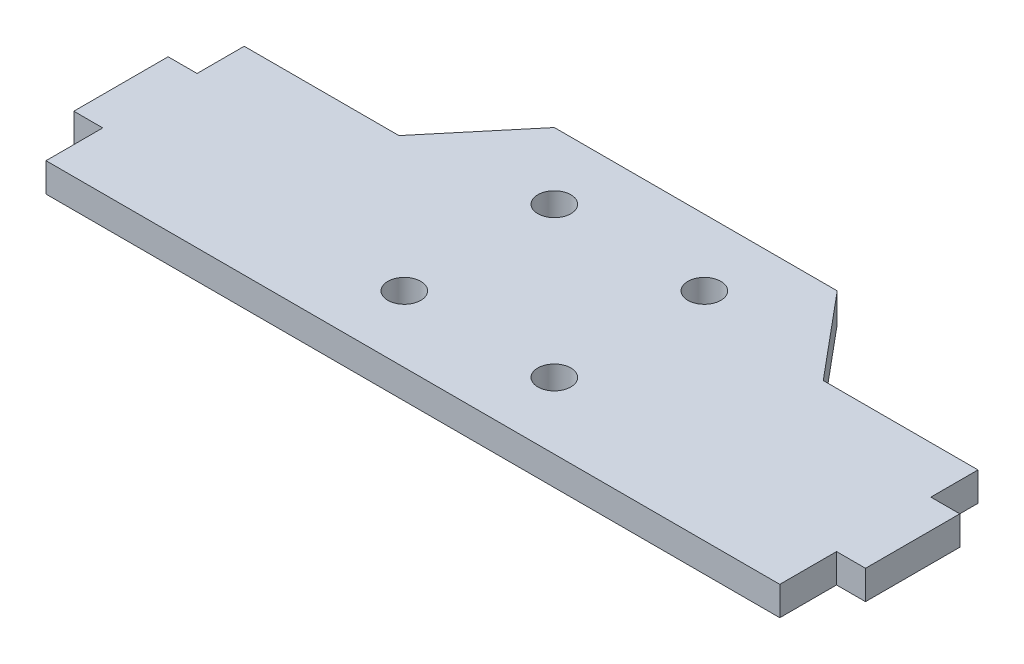
ISO-10303-21;
HEADER;
FILE_DESCRIPTION(('STEP AP214'),'2;1');
FILE_NAME('part.step','',(''),(''),'','','');
FILE_SCHEMA(('AUTOMOTIVE_DESIGN { 1 0 10303 214 1 1 1 1 }'));
ENDSEC;
DATA;
#1=APPLICATION_CONTEXT('core data for automotive mechanical design processes');
#2=APPLICATION_PROTOCOL_DEFINITION('international standard','automotive_design',2000,#1);
#3=PRODUCT_CONTEXT('',#1,'mechanical');
#4=PRODUCT('Part','Part','',(#3));
#5=PRODUCT_RELATED_PRODUCT_CATEGORY('part','',(#4));
#6=PRODUCT_DEFINITION_FORMATION('','',#4);
#7=PRODUCT_DEFINITION_CONTEXT('part definition',#1,'design');
#8=PRODUCT_DEFINITION('design','',#6,#7);
#9=PRODUCT_DEFINITION_SHAPE('','',#8);
#10=(LENGTH_UNIT() NAMED_UNIT(*) SI_UNIT(.MILLI.,.METRE.));
#11=(NAMED_UNIT(*) PLANE_ANGLE_UNIT() SI_UNIT($,.RADIAN.));
#12=(NAMED_UNIT(*) SI_UNIT($,.STERADIAN.) SOLID_ANGLE_UNIT());
#13=UNCERTAINTY_MEASURE_WITH_UNIT(LENGTH_MEASURE(1.E-05),#10,'distance_accuracy_value','');
#14=(GEOMETRIC_REPRESENTATION_CONTEXT(3) GLOBAL_UNCERTAINTY_ASSIGNED_CONTEXT((#13)) GLOBAL_UNIT_ASSIGNED_CONTEXT((#10,
#11,#12)) REPRESENTATION_CONTEXT('',''));
#15=CARTESIAN_POINT('',(0.,0.,0.));
#16=DIRECTION('',(0.,0.,1.));
#17=DIRECTION('',(1.,0.,0.));
#18=AXIS2_PLACEMENT_3D('',#15,#16,#17);
#19=CARTESIAN_POINT('',(0.,-363.21,0.));
#20=DIRECTION('',(0.,1.,0.));
#21=DIRECTION('',(0.,0.,1.));
#22=AXIS2_PLACEMENT_3D('',#19,#20,#21);
#23=PLANE('',#22);
#24=CARTESIAN_POINT('',(-7.95495128834865,-363.21,18.0450487116513));
#25=DIRECTION('',(0.,1.,0.));
#26=DIRECTION('',(0.,0.,1.));
#27=AXIS2_PLACEMENT_3D('',#24,#25,#26);
#28=CIRCLE('',#27,1.75);
#29=CARTESIAN_POINT('',(-7.95495128834865,-363.21,19.7950487116513));
#30=VERTEX_POINT('',#29);
#31=EDGE_CURVE('E524',#30,#30,#28,.T.);
#32=ORIENTED_EDGE('',*,*,#31,.F.);
#33=EDGE_LOOP('',(#32));
#34=FACE_BOUND('',#33,.T.);
#35=CARTESIAN_POINT('',(7.95495128834865,-363.21,33.9549512883487));
#36=DIRECTION('',(0.,1.,0.));
#37=DIRECTION('',(0.,0.,1.));
#38=AXIS2_PLACEMENT_3D('',#35,#36,#37);
#39=CIRCLE('',#38,1.75);
#40=CARTESIAN_POINT('',(7.95495128834865,-363.21,35.7049512883487));
#41=VERTEX_POINT('',#40);
#42=EDGE_CURVE('E196',#41,#41,#39,.T.);
#43=ORIENTED_EDGE('',*,*,#42,.F.);
#44=EDGE_LOOP('',(#43));
#45=FACE_BOUND('',#44,.T.);
#46=DIRECTION('',(1.,0.,0.));
#47=VECTOR('',#46,1.);
#48=CARTESIAN_POINT('',(38.9099999999999,-363.21,41.));
#49=LINE('',#48,#47);
#50=CARTESIAN_POINT('',(-38.9099999999999,-363.21,41.));
#51=VERTEX_POINT('',#50);
#52=CARTESIAN_POINT('',(38.9099999999999,-363.21,41.));
#53=VERTEX_POINT('',#52);
#54=EDGE_CURVE('E60',#51,#53,#49,.T.);
#55=ORIENTED_EDGE('',*,*,#54,.T.);
#56=DIRECTION('',(0.,0.,-1.));
#57=VECTOR('',#56,1.);
#58=CARTESIAN_POINT('',(38.9099999999999,-363.21,34.98));
#59=LINE('',#58,#57);
#60=CARTESIAN_POINT('',(38.9099999999999,-363.21,34.98));
#61=VERTEX_POINT('',#60);
#62=EDGE_CURVE('E129',#53,#61,#59,.T.);
#63=ORIENTED_EDGE('',*,*,#62,.T.);
#64=DIRECTION('',(1.,0.,0.));
#65=VECTOR('',#64,1.);
#66=CARTESIAN_POINT('',(41.9799999999999,-363.21,34.98));
#67=LINE('',#66,#65);
#68=CARTESIAN_POINT('',(41.9799999999999,-363.21,34.98));
#69=VERTEX_POINT('',#68);
#70=EDGE_CURVE('E261',#61,#69,#67,.T.);
#71=ORIENTED_EDGE('',*,*,#70,.T.);
#72=DIRECTION('',(0.,0.,-1.));
#73=VECTOR('',#72,1.);
#74=CARTESIAN_POINT('',(41.9799999999999,-363.21,24.98));
#75=LINE('',#74,#73);
#76=CARTESIAN_POINT('',(41.9799999999999,-363.21,24.98));
#77=VERTEX_POINT('',#76);
#78=EDGE_CURVE('E278',#69,#77,#75,.T.);
#79=ORIENTED_EDGE('',*,*,#78,.T.);
#80=DIRECTION('',(-1.,0.,0.));
#81=VECTOR('',#80,1.);
#82=CARTESIAN_POINT('',(38.9099999999999,-363.21,24.98));
#83=LINE('',#82,#81);
#84=CARTESIAN_POINT('',(38.9099999999999,-363.21,24.98));
#85=VERTEX_POINT('',#84);
#86=EDGE_CURVE('E275',#77,#85,#83,.T.);
#87=ORIENTED_EDGE('',*,*,#86,.T.);
#88=DIRECTION('',(0.,0.,-1.));
#89=VECTOR('',#88,1.);
#90=CARTESIAN_POINT('',(38.9099999999999,-363.21,19.98));
#91=LINE('',#90,#89);
#92=CARTESIAN_POINT('',(38.9099999999999,-363.21,19.98));
#93=VERTEX_POINT('',#92);
#94=EDGE_CURVE('E277',#85,#93,#91,.T.);
#95=ORIENTED_EDGE('',*,*,#94,.T.);
#96=DIRECTION('',(-1.,0.,0.));
#97=VECTOR('',#96,1.);
#98=CARTESIAN_POINT('',(22.5,-363.21,19.98));
#99=LINE('',#98,#97);
#100=CARTESIAN_POINT('',(22.5,-363.21,19.98));
#101=VERTEX_POINT('',#100);
#102=EDGE_CURVE('E280',#93,#101,#99,.T.);
#103=ORIENTED_EDGE('',*,*,#102,.T.);
#104=DIRECTION('',(-0.641024704471856,0.,-0.767520246154308));
#105=VECTOR('',#104,1.);
#106=CARTESIAN_POINT('',(15.,-363.21,11.));
#107=LINE('',#106,#105);
#108=CARTESIAN_POINT('',(15.,-363.21,11.));
#109=VERTEX_POINT('',#108);
#110=EDGE_CURVE('E286',#101,#109,#107,.T.);
#111=ORIENTED_EDGE('',*,*,#110,.T.);
#112=DIRECTION('',(-1.,0.,0.));
#113=VECTOR('',#112,1.);
#114=CARTESIAN_POINT('',(15.,-363.21,11.));
#115=LINE('',#114,#113);
#116=CARTESIAN_POINT('',(-15.,-363.21,11.));
#117=VERTEX_POINT('',#116);
#118=EDGE_CURVE('E288',#109,#117,#115,.T.);
#119=ORIENTED_EDGE('',*,*,#118,.T.);
#120=DIRECTION('',(-0.641024704471856,0.,0.767520246154308));
#121=VECTOR('',#120,1.);
#122=CARTESIAN_POINT('',(-15.,-363.21,11.));
#123=LINE('',#122,#121);
#124=CARTESIAN_POINT('',(-22.4999999999999,-363.21,19.98));
#125=VERTEX_POINT('',#124);
#126=EDGE_CURVE('E290',#117,#125,#123,.T.);
#127=ORIENTED_EDGE('',*,*,#126,.T.);
#128=DIRECTION('',(-1.,0.,0.));
#129=VECTOR('',#128,1.);
#130=CARTESIAN_POINT('',(-22.4999999999999,-363.21,19.98));
#131=LINE('',#130,#129);
#132=CARTESIAN_POINT('',(-38.9099999999999,-363.21,19.98));
#133=VERTEX_POINT('',#132);
#134=EDGE_CURVE('E292',#125,#133,#131,.T.);
#135=ORIENTED_EDGE('',*,*,#134,.T.);
#136=DIRECTION('',(0.,0.,1.));
#137=VECTOR('',#136,1.);
#138=CARTESIAN_POINT('',(-38.9099999999999,-363.21,19.98));
#139=LINE('',#138,#137);
#140=CARTESIAN_POINT('',(-38.9099999999999,-363.21,24.98));
#141=VERTEX_POINT('',#140);
#142=EDGE_CURVE('E294',#133,#141,#139,.T.);
#143=ORIENTED_EDGE('',*,*,#142,.T.);
#144=DIRECTION('',(-1.,0.,0.));
#145=VECTOR('',#144,1.);
#146=CARTESIAN_POINT('',(-38.9099999999999,-363.21,24.98));
#147=LINE('',#146,#145);
#148=CARTESIAN_POINT('',(-41.9799999999999,-363.21,24.98));
#149=VERTEX_POINT('',#148);
#150=EDGE_CURVE('E173',#141,#149,#147,.T.);
#151=ORIENTED_EDGE('',*,*,#150,.T.);
#152=DIRECTION('',(0.,0.,1.));
#153=VECTOR('',#152,1.);
#154=CARTESIAN_POINT('',(-41.9799999999999,-363.21,24.98));
#155=LINE('',#154,#153);
#156=CARTESIAN_POINT('',(-41.9799999999999,-363.21,34.98));
#157=VERTEX_POINT('',#156);
#158=EDGE_CURVE('E167',#149,#157,#155,.T.);
#159=ORIENTED_EDGE('',*,*,#158,.T.);
#160=DIRECTION('',(1.,0.,0.));
#161=VECTOR('',#160,1.);
#162=CARTESIAN_POINT('',(-41.9799999999999,-363.21,34.98));
#163=LINE('',#162,#161);
#164=CARTESIAN_POINT('',(-38.9099999999999,-363.21,34.98));
#165=VERTEX_POINT('',#164);
#166=EDGE_CURVE('E171',#157,#165,#163,.T.);
#167=ORIENTED_EDGE('',*,*,#166,.T.);
#168=DIRECTION('',(0.,0.,1.));
#169=VECTOR('',#168,1.);
#170=CARTESIAN_POINT('',(-38.9099999999999,-363.21,34.98));
#171=LINE('',#170,#169);
#172=EDGE_CURVE('E187',#165,#51,#171,.T.);
#173=ORIENTED_EDGE('',*,*,#172,.T.);
#174=EDGE_LOOP('',(#55,#63,#71,#79,#87,#95,#103,#111,#119,#127,#135,#143,#151,#159,#167,#173));
#175=FACE_BOUND('',#174,.T.);
#176=CARTESIAN_POINT('',(-7.95495128834867,-363.21,33.9549512883486));
#177=DIRECTION('',(0.,1.,0.));
#178=DIRECTION('',(0.,0.,1.));
#179=AXIS2_PLACEMENT_3D('',#176,#177,#178);
#180=CIRCLE('',#179,1.75);
#181=CARTESIAN_POINT('',(-7.95495128834867,-363.21,35.7049512883486));
#182=VERTEX_POINT('',#181);
#183=EDGE_CURVE('E530',#182,#182,#180,.T.);
#184=ORIENTED_EDGE('',*,*,#183,.F.);
#185=EDGE_LOOP('',(#184));
#186=FACE_BOUND('',#185,.T.);
#187=CARTESIAN_POINT('',(7.95495128834867,-363.21,18.0450487116514));
#188=DIRECTION('',(0.,1.,0.));
#189=DIRECTION('',(0.,0.,1.));
#190=AXIS2_PLACEMENT_3D('',#187,#188,#189);
#191=CIRCLE('',#190,1.75);
#192=CARTESIAN_POINT('',(7.95495128834867,-363.21,19.7950487116514));
#193=VERTEX_POINT('',#192);
#194=EDGE_CURVE('E515',#193,#193,#191,.T.);
#195=ORIENTED_EDGE('',*,*,#194,.F.);
#196=EDGE_LOOP('',(#195));
#197=FACE_BOUND('',#196,.T.);
#198=ADVANCED_FACE('F43',(#34,#45,#175,#186,#197),#23,.T.);
#199=CARTESIAN_POINT('',(0.,-366.28,0.));
#200=DIRECTION('',(0.,1.,0.));
#201=DIRECTION('',(0.,0.,1.));
#202=AXIS2_PLACEMENT_3D('',#199,#200,#201);
#203=PLANE('',#202);
#204=DIRECTION('',(0.,0.,-1.));
#205=VECTOR('',#204,1.);
#206=CARTESIAN_POINT('',(38.9099999999999,-366.28,34.98));
#207=LINE('',#206,#205);
#208=CARTESIAN_POINT('',(38.9099999999999,-366.28,41.));
#209=VERTEX_POINT('',#208);
#210=CARTESIAN_POINT('',(38.9099999999999,-366.28,34.98));
#211=VERTEX_POINT('',#210);
#212=EDGE_CURVE('E193',#209,#211,#207,.T.);
#213=ORIENTED_EDGE('',*,*,#212,.F.);
#214=DIRECTION('',(1.,0.,0.));
#215=VECTOR('',#214,1.);
#216=CARTESIAN_POINT('',(15.,-366.28,41.));
#217=LINE('',#216,#215);
#218=CARTESIAN_POINT('',(-38.9099999999999,-366.28,41.));
#219=VERTEX_POINT('',#218);
#220=EDGE_CURVE('E121',#219,#209,#217,.T.);
#221=ORIENTED_EDGE('',*,*,#220,.F.);
#222=DIRECTION('',(0.,0.,1.));
#223=VECTOR('',#222,1.);
#224=CARTESIAN_POINT('',(-38.9099999999999,-366.28,34.98));
#225=LINE('',#224,#223);
#226=CARTESIAN_POINT('',(-38.9099999999999,-366.28,34.98));
#227=VERTEX_POINT('',#226);
#228=EDGE_CURVE('E220',#227,#219,#225,.T.);
#229=ORIENTED_EDGE('',*,*,#228,.F.);
#230=DIRECTION('',(1.,0.,0.));
#231=VECTOR('',#230,1.);
#232=CARTESIAN_POINT('',(-41.9799999999999,-366.28,34.98));
#233=LINE('',#232,#231);
#234=CARTESIAN_POINT('',(-41.9799999999999,-366.28,34.98));
#235=VERTEX_POINT('',#234);
#236=EDGE_CURVE('E114',#235,#227,#233,.T.);
#237=ORIENTED_EDGE('',*,*,#236,.F.);
#238=DIRECTION('',(0.,0.,1.));
#239=VECTOR('',#238,1.);
#240=CARTESIAN_POINT('',(-41.9799999999999,-366.28,24.98));
#241=LINE('',#240,#239);
#242=CARTESIAN_POINT('',(-41.9799999999999,-366.28,24.98));
#243=VERTEX_POINT('',#242);
#244=EDGE_CURVE('E181',#243,#235,#241,.T.);
#245=ORIENTED_EDGE('',*,*,#244,.F.);
#246=DIRECTION('',(-1.,0.,0.));
#247=VECTOR('',#246,1.);
#248=CARTESIAN_POINT('',(-38.9099999999999,-366.28,24.98));
#249=LINE('',#248,#247);
#250=CARTESIAN_POINT('',(-38.9099999999999,-366.28,24.98));
#251=VERTEX_POINT('',#250);
#252=EDGE_CURVE('E216',#251,#243,#249,.T.);
#253=ORIENTED_EDGE('',*,*,#252,.F.);
#254=DIRECTION('',(0.,0.,1.));
#255=VECTOR('',#254,1.);
#256=CARTESIAN_POINT('',(-38.9099999999999,-366.28,19.98));
#257=LINE('',#256,#255);
#258=CARTESIAN_POINT('',(-38.9099999999999,-366.28,19.98));
#259=VERTEX_POINT('',#258);
#260=EDGE_CURVE('E214',#259,#251,#257,.T.);
#261=ORIENTED_EDGE('',*,*,#260,.F.);
#262=DIRECTION('',(-1.,0.,0.));
#263=VECTOR('',#262,1.);
#264=CARTESIAN_POINT('',(-22.4999999999999,-366.28,19.98));
#265=LINE('',#264,#263);
#266=CARTESIAN_POINT('',(-22.4999999999999,-366.28,19.98));
#267=VERTEX_POINT('',#266);
#268=EDGE_CURVE('E212',#267,#259,#265,.T.);
#269=ORIENTED_EDGE('',*,*,#268,.F.);
#270=DIRECTION('',(-0.641024704471856,0.,0.767520246154308));
#271=VECTOR('',#270,1.);
#272=CARTESIAN_POINT('',(-15.,-366.28,11.));
#273=LINE('',#272,#271);
#274=CARTESIAN_POINT('',(-15.,-366.28,11.));
#275=VERTEX_POINT('',#274);
#276=EDGE_CURVE('E210',#275,#267,#273,.T.);
#277=ORIENTED_EDGE('',*,*,#276,.F.);
#278=DIRECTION('',(-1.,0.,0.));
#279=VECTOR('',#278,1.);
#280=CARTESIAN_POINT('',(15.,-366.28,11.));
#281=LINE('',#280,#279);
#282=CARTESIAN_POINT('',(15.,-366.28,11.));
#283=VERTEX_POINT('',#282);
#284=EDGE_CURVE('E208',#283,#275,#281,.T.);
#285=ORIENTED_EDGE('',*,*,#284,.F.);
#286=DIRECTION('',(-0.641024704471856,0.,-0.767520246154308));
#287=VECTOR('',#286,1.);
#288=CARTESIAN_POINT('',(15.,-366.28,11.));
#289=LINE('',#288,#287);
#290=CARTESIAN_POINT('',(22.5,-366.28,19.98));
#291=VERTEX_POINT('',#290);
#292=EDGE_CURVE('E206',#291,#283,#289,.T.);
#293=ORIENTED_EDGE('',*,*,#292,.F.);
#294=DIRECTION('',(-1.,0.,0.));
#295=VECTOR('',#294,1.);
#296=CARTESIAN_POINT('',(22.5,-366.28,19.98));
#297=LINE('',#296,#295);
#298=CARTESIAN_POINT('',(38.9099999999999,-366.28,19.98));
#299=VERTEX_POINT('',#298);
#300=EDGE_CURVE('E204',#299,#291,#297,.T.);
#301=ORIENTED_EDGE('',*,*,#300,.F.);
#302=DIRECTION('',(0.,0.,-1.));
#303=VECTOR('',#302,1.);
#304=CARTESIAN_POINT('',(38.9099999999999,-366.28,19.98));
#305=LINE('',#304,#303);
#306=CARTESIAN_POINT('',(38.9099999999999,-366.28,24.98));
#307=VERTEX_POINT('',#306);
#308=EDGE_CURVE('E202',#307,#299,#305,.T.);
#309=ORIENTED_EDGE('',*,*,#308,.F.);
#310=DIRECTION('',(-1.,0.,0.));
#311=VECTOR('',#310,1.);
#312=CARTESIAN_POINT('',(38.9099999999999,-366.28,24.98));
#313=LINE('',#312,#311);
#314=CARTESIAN_POINT('',(41.9799999999999,-366.28,24.98));
#315=VERTEX_POINT('',#314);
#316=EDGE_CURVE('E200',#315,#307,#313,.T.);
#317=ORIENTED_EDGE('',*,*,#316,.F.);
#318=DIRECTION('',(0.,0.,-1.));
#319=VECTOR('',#318,1.);
#320=CARTESIAN_POINT('',(41.9799999999999,-366.28,24.98));
#321=LINE('',#320,#319);
#322=CARTESIAN_POINT('',(41.9799999999999,-366.28,34.98));
#323=VERTEX_POINT('',#322);
#324=EDGE_CURVE('E198',#323,#315,#321,.T.);
#325=ORIENTED_EDGE('',*,*,#324,.F.);
#326=DIRECTION('',(1.,0.,0.));
#327=VECTOR('',#326,1.);
#328=CARTESIAN_POINT('',(41.9799999999999,-366.28,34.98));
#329=LINE('',#328,#327);
#330=EDGE_CURVE('E195',#211,#323,#329,.T.);
#331=ORIENTED_EDGE('',*,*,#330,.F.);
#332=EDGE_LOOP('',(#213,#221,#229,#237,#245,#253,#261,#269,#277,#285,#293,#301,#309,#317,#325,#331));
#333=FACE_BOUND('',#332,.T.);
#334=CARTESIAN_POINT('',(7.95495128834865,-366.28,33.9549512883487));
#335=DIRECTION('',(0.,1.,0.));
#336=DIRECTION('',(0.,0.,1.));
#337=AXIS2_PLACEMENT_3D('',#334,#335,#336);
#338=CIRCLE('',#337,1.75);
#339=CARTESIAN_POINT('',(7.95495128834865,-366.28,35.7049512883487));
#340=VERTEX_POINT('',#339);
#341=EDGE_CURVE('E533',#340,#340,#338,.T.);
#342=ORIENTED_EDGE('',*,*,#341,.T.);
#343=EDGE_LOOP('',(#342));
#344=FACE_BOUND('',#343,.T.);
#345=CARTESIAN_POINT('',(-7.95495128834867,-366.28,33.9549512883486));
#346=DIRECTION('',(0.,1.,0.));
#347=DIRECTION('',(0.,0.,1.));
#348=AXIS2_PLACEMENT_3D('',#345,#346,#347);
#349=CIRCLE('',#348,1.75);
#350=CARTESIAN_POINT('',(-7.95495128834867,-366.28,35.7049512883486));
#351=VERTEX_POINT('',#350);
#352=EDGE_CURVE('E527',#351,#351,#349,.T.);
#353=ORIENTED_EDGE('',*,*,#352,.T.);
#354=EDGE_LOOP('',(#353));
#355=FACE_BOUND('',#354,.T.);
#356=CARTESIAN_POINT('',(-7.95495128834865,-366.28,18.0450487116513));
#357=DIRECTION('',(0.,1.,0.));
#358=DIRECTION('',(0.,0.,1.));
#359=AXIS2_PLACEMENT_3D('',#356,#357,#358);
#360=CIRCLE('',#359,1.75);
#361=CARTESIAN_POINT('',(-7.95495128834865,-366.28,19.7950487116513));
#362=VERTEX_POINT('',#361);
#363=EDGE_CURVE('E521',#362,#362,#360,.T.);
#364=ORIENTED_EDGE('',*,*,#363,.T.);
#365=EDGE_LOOP('',(#364));
#366=FACE_BOUND('',#365,.T.);
#367=CARTESIAN_POINT('',(7.95495128834867,-366.28,18.0450487116514));
#368=DIRECTION('',(0.,1.,0.));
#369=DIRECTION('',(0.,0.,1.));
#370=AXIS2_PLACEMENT_3D('',#367,#368,#369);
#371=CIRCLE('',#370,1.75);
#372=CARTESIAN_POINT('',(7.95495128834867,-366.28,19.7950487116514));
#373=VERTEX_POINT('',#372);
#374=EDGE_CURVE('E518',#373,#373,#371,.T.);
#375=ORIENTED_EDGE('',*,*,#374,.T.);
#376=EDGE_LOOP('',(#375));
#377=FACE_BOUND('',#376,.T.);
#378=ADVANCED_FACE('F263',(#333,#344,#355,#366,#377),#203,.F.);
#379=CARTESIAN_POINT('',(38.9099999999999,-363.21,34.98));
#380=DIRECTION('',(-1.,0.,0.));
#381=DIRECTION('',(0.,0.,1.));
#382=AXIS2_PLACEMENT_3D('',#379,#380,#381);
#383=PLANE('',#382);
#384=ORIENTED_EDGE('',*,*,#212,.T.);
#385=DIRECTION('',(0.,-1.,0.));
#386=VECTOR('',#385,1.);
#387=CARTESIAN_POINT('',(38.9099999999999,-363.21,34.98));
#388=LINE('',#387,#386);
#389=EDGE_CURVE('E52',#61,#211,#388,.T.);
#390=ORIENTED_EDGE('',*,*,#389,.F.);
#391=ORIENTED_EDGE('',*,*,#62,.F.);
#392=DIRECTION('',(0.,-1.,0.));
#393=VECTOR('',#392,1.);
#394=CARTESIAN_POINT('',(38.9099999999999,-363.21,41.));
#395=LINE('',#394,#393);
#396=EDGE_CURVE('E11',#53,#209,#395,.T.);
#397=ORIENTED_EDGE('',*,*,#396,.T.);
#398=EDGE_LOOP('',(#384,#390,#391,#397));
#399=FACE_BOUND('',#398,.T.);
#400=ADVANCED_FACE('F45',(#399),#383,.F.);
#401=CARTESIAN_POINT('',(41.9799999999999,-363.21,34.98));
#402=DIRECTION('',(0.,0.,-1.));
#403=DIRECTION('',(-1.,0.,0.));
#404=AXIS2_PLACEMENT_3D('',#401,#402,#403);
#405=PLANE('',#404);
#406=ORIENTED_EDGE('',*,*,#330,.T.);
#407=DIRECTION('',(0.,-1.,0.));
#408=VECTOR('',#407,1.);
#409=CARTESIAN_POINT('',(41.9799999999999,-363.21,34.98));
#410=LINE('',#409,#408);
#411=EDGE_CURVE('E253',#69,#323,#410,.T.);
#412=ORIENTED_EDGE('',*,*,#411,.F.);
#413=ORIENTED_EDGE('',*,*,#70,.F.);
#414=ORIENTED_EDGE('',*,*,#389,.T.);
#415=EDGE_LOOP('',(#406,#412,#413,#414));
#416=FACE_BOUND('',#415,.T.);
#417=ADVANCED_FACE('F259',(#416),#405,.F.);
#418=CARTESIAN_POINT('',(41.9799999999999,-363.21,24.98));
#419=DIRECTION('',(-1.,0.,0.));
#420=DIRECTION('',(0.,0.,1.));
#421=AXIS2_PLACEMENT_3D('',#418,#419,#420);
#422=PLANE('',#421);
#423=ORIENTED_EDGE('',*,*,#324,.T.);
#424=DIRECTION('',(0.,-1.,0.));
#425=VECTOR('',#424,1.);
#426=CARTESIAN_POINT('',(41.9799999999999,-363.21,24.98));
#427=LINE('',#426,#425);
#428=EDGE_CURVE('E250',#77,#315,#427,.T.);
#429=ORIENTED_EDGE('',*,*,#428,.F.);
#430=ORIENTED_EDGE('',*,*,#78,.F.);
#431=ORIENTED_EDGE('',*,*,#411,.T.);
#432=EDGE_LOOP('',(#423,#429,#430,#431));
#433=FACE_BOUND('',#432,.T.);
#434=ADVANCED_FACE('F269',(#433),#422,.F.);
#435=CARTESIAN_POINT('',(38.9099999999999,-363.21,24.98));
#436=DIRECTION('',(0.,0.,1.));
#437=DIRECTION('',(1.,0.,0.));
#438=AXIS2_PLACEMENT_3D('',#435,#436,#437);
#439=PLANE('',#438);
#440=ORIENTED_EDGE('',*,*,#316,.T.);
#441=DIRECTION('',(0.,-1.,0.));
#442=VECTOR('',#441,1.);
#443=CARTESIAN_POINT('',(38.9099999999999,-363.21,24.98));
#444=LINE('',#443,#442);
#445=EDGE_CURVE('E247',#85,#307,#444,.T.);
#446=ORIENTED_EDGE('',*,*,#445,.F.);
#447=ORIENTED_EDGE('',*,*,#86,.F.);
#448=ORIENTED_EDGE('',*,*,#428,.T.);
#449=EDGE_LOOP('',(#440,#446,#447,#448));
#450=FACE_BOUND('',#449,.T.);
#451=ADVANCED_FACE('F273',(#450),#439,.F.);
#452=CARTESIAN_POINT('',(38.9099999999999,-363.21,19.98));
#453=DIRECTION('',(-1.,0.,0.));
#454=DIRECTION('',(0.,0.,1.));
#455=AXIS2_PLACEMENT_3D('',#452,#453,#454);
#456=PLANE('',#455);
#457=ORIENTED_EDGE('',*,*,#308,.T.);
#458=DIRECTION('',(0.,-1.,0.));
#459=VECTOR('',#458,1.);
#460=CARTESIAN_POINT('',(38.9099999999999,-363.21,19.98));
#461=LINE('',#460,#459);
#462=EDGE_CURVE('E244',#93,#299,#461,.T.);
#463=ORIENTED_EDGE('',*,*,#462,.F.);
#464=ORIENTED_EDGE('',*,*,#94,.F.);
#465=ORIENTED_EDGE('',*,*,#445,.T.);
#466=EDGE_LOOP('',(#457,#463,#464,#465));
#467=FACE_BOUND('',#466,.T.);
#468=ADVANCED_FACE('F359',(#467),#456,.F.);
#469=CARTESIAN_POINT('',(22.5,-363.21,19.98));
#470=DIRECTION('',(0.,0.,1.));
#471=DIRECTION('',(1.,0.,0.));
#472=AXIS2_PLACEMENT_3D('',#469,#470,#471);
#473=PLANE('',#472);
#474=ORIENTED_EDGE('',*,*,#300,.T.);
#475=DIRECTION('',(0.,-1.,0.));
#476=VECTOR('',#475,1.);
#477=CARTESIAN_POINT('',(22.5,-363.21,19.98));
#478=LINE('',#477,#476);
#479=EDGE_CURVE('E241',#101,#291,#478,.T.);
#480=ORIENTED_EDGE('',*,*,#479,.F.);
#481=ORIENTED_EDGE('',*,*,#102,.F.);
#482=ORIENTED_EDGE('',*,*,#462,.T.);
#483=EDGE_LOOP('',(#474,#480,#481,#482));
#484=FACE_BOUND('',#483,.T.);
#485=ADVANCED_FACE('F355',(#484),#473,.F.);
#486=CARTESIAN_POINT('',(15.,-363.21,11.));
#487=DIRECTION('',(-0.767520246154308,0.,0.641024704471856));
#488=DIRECTION('',(0.641024704471856,0.,0.767520246154308));
#489=AXIS2_PLACEMENT_3D('',#486,#487,#488);
#490=PLANE('',#489);
#491=ORIENTED_EDGE('',*,*,#292,.T.);
#492=DIRECTION('',(0.,-1.,0.));
#493=VECTOR('',#492,1.);
#494=CARTESIAN_POINT('',(15.,-363.21,11.));
#495=LINE('',#494,#493);
#496=EDGE_CURVE('E238',#109,#283,#495,.T.);
#497=ORIENTED_EDGE('',*,*,#496,.F.);
#498=ORIENTED_EDGE('',*,*,#110,.F.);
#499=ORIENTED_EDGE('',*,*,#479,.T.);
#500=EDGE_LOOP('',(#491,#497,#498,#499));
#501=FACE_BOUND('',#500,.T.);
#502=ADVANCED_FACE('F351',(#501),#490,.F.);
#503=CARTESIAN_POINT('',(15.,-363.21,11.));
#504=DIRECTION('',(0.,0.,1.));
#505=DIRECTION('',(1.,0.,0.));
#506=AXIS2_PLACEMENT_3D('',#503,#504,#505);
#507=PLANE('',#506);
#508=ORIENTED_EDGE('',*,*,#284,.T.);
#509=DIRECTION('',(0.,-1.,0.));
#510=VECTOR('',#509,1.);
#511=CARTESIAN_POINT('',(-15.,-363.21,11.));
#512=LINE('',#511,#510);
#513=EDGE_CURVE('E235',#117,#275,#512,.T.);
#514=ORIENTED_EDGE('',*,*,#513,.F.);
#515=ORIENTED_EDGE('',*,*,#118,.F.);
#516=ORIENTED_EDGE('',*,*,#496,.T.);
#517=EDGE_LOOP('',(#508,#514,#515,#516));
#518=FACE_BOUND('',#517,.T.);
#519=ADVANCED_FACE('F347',(#518),#507,.F.);
#520=CARTESIAN_POINT('',(-15.,-363.21,11.));
#521=DIRECTION('',(0.767520246154308,0.,0.641024704471856));
#522=DIRECTION('',(0.641024704471856,0.,-0.767520246154308));
#523=AXIS2_PLACEMENT_3D('',#520,#521,#522);
#524=PLANE('',#523);
#525=ORIENTED_EDGE('',*,*,#276,.T.);
#526=DIRECTION('',(0.,-1.,0.));
#527=VECTOR('',#526,1.);
#528=CARTESIAN_POINT('',(-22.4999999999999,-363.21,19.98));
#529=LINE('',#528,#527);
#530=EDGE_CURVE('E232',#125,#267,#529,.T.);
#531=ORIENTED_EDGE('',*,*,#530,.F.);
#532=ORIENTED_EDGE('',*,*,#126,.F.);
#533=ORIENTED_EDGE('',*,*,#513,.T.);
#534=EDGE_LOOP('',(#525,#531,#532,#533));
#535=FACE_BOUND('',#534,.T.);
#536=ADVANCED_FACE('F343',(#535),#524,.F.);
#537=CARTESIAN_POINT('',(-22.4999999999999,-363.21,19.98));
#538=DIRECTION('',(0.,0.,1.));
#539=DIRECTION('',(1.,0.,0.));
#540=AXIS2_PLACEMENT_3D('',#537,#538,#539);
#541=PLANE('',#540);
#542=ORIENTED_EDGE('',*,*,#268,.T.);
#543=DIRECTION('',(0.,-1.,0.));
#544=VECTOR('',#543,1.);
#545=CARTESIAN_POINT('',(-38.9099999999999,-363.21,19.98));
#546=LINE('',#545,#544);
#547=EDGE_CURVE('E229',#133,#259,#546,.T.);
#548=ORIENTED_EDGE('',*,*,#547,.F.);
#549=ORIENTED_EDGE('',*,*,#134,.F.);
#550=ORIENTED_EDGE('',*,*,#530,.T.);
#551=EDGE_LOOP('',(#542,#548,#549,#550));
#552=FACE_BOUND('',#551,.T.);
#553=ADVANCED_FACE('F340',(#552),#541,.F.);
#554=CARTESIAN_POINT('',(-38.9099999999999,-363.21,19.98));
#555=DIRECTION('',(1.,0.,0.));
#556=DIRECTION('',(0.,0.,-1.));
#557=AXIS2_PLACEMENT_3D('',#554,#555,#556);
#558=PLANE('',#557);
#559=ORIENTED_EDGE('',*,*,#260,.T.);
#560=DIRECTION('',(0.,-1.,0.));
#561=VECTOR('',#560,1.);
#562=CARTESIAN_POINT('',(-38.9099999999999,-363.21,24.98));
#563=LINE('',#562,#561);
#564=EDGE_CURVE('E226',#141,#251,#563,.T.);
#565=ORIENTED_EDGE('',*,*,#564,.F.);
#566=ORIENTED_EDGE('',*,*,#142,.F.);
#567=ORIENTED_EDGE('',*,*,#547,.T.);
#568=EDGE_LOOP('',(#559,#565,#566,#567));
#569=FACE_BOUND('',#568,.T.);
#570=ADVANCED_FACE('F300',(#569),#558,.F.);
#571=CARTESIAN_POINT('',(-38.9099999999999,-363.21,24.98));
#572=DIRECTION('',(0.,0.,1.));
#573=DIRECTION('',(1.,0.,0.));
#574=AXIS2_PLACEMENT_3D('',#571,#572,#573);
#575=PLANE('',#574);
#576=ORIENTED_EDGE('',*,*,#252,.T.);
#577=DIRECTION('',(0.,-1.,0.));
#578=VECTOR('',#577,1.);
#579=CARTESIAN_POINT('',(-41.9799999999999,-363.21,24.98));
#580=LINE('',#579,#578);
#581=EDGE_CURVE('E182',#149,#243,#580,.T.);
#582=ORIENTED_EDGE('',*,*,#581,.F.);
#583=ORIENTED_EDGE('',*,*,#150,.F.);
#584=ORIENTED_EDGE('',*,*,#564,.T.);
#585=EDGE_LOOP('',(#576,#582,#583,#584));
#586=FACE_BOUND('',#585,.T.);
#587=ADVANCED_FACE('F304',(#586),#575,.F.);
#588=CARTESIAN_POINT('',(-41.9799999999999,-363.21,24.98));
#589=DIRECTION('',(1.,0.,0.));
#590=DIRECTION('',(0.,0.,-1.));
#591=AXIS2_PLACEMENT_3D('',#588,#589,#590);
#592=PLANE('',#591);
#593=ORIENTED_EDGE('',*,*,#244,.T.);
#594=DIRECTION('',(0.,-1.,0.));
#595=VECTOR('',#594,1.);
#596=CARTESIAN_POINT('',(-41.9799999999999,-363.21,34.98));
#597=LINE('',#596,#595);
#598=EDGE_CURVE('E178',#157,#235,#597,.T.);
#599=ORIENTED_EDGE('',*,*,#598,.F.);
#600=ORIENTED_EDGE('',*,*,#158,.F.);
#601=ORIENTED_EDGE('',*,*,#581,.T.);
#602=EDGE_LOOP('',(#593,#599,#600,#601));
#603=FACE_BOUND('',#602,.T.);
#604=ADVANCED_FACE('F179',(#603),#592,.F.);
#605=CARTESIAN_POINT('',(-41.9799999999999,-363.21,34.98));
#606=DIRECTION('',(0.,0.,-1.));
#607=DIRECTION('',(-1.,0.,0.));
#608=AXIS2_PLACEMENT_3D('',#605,#606,#607);
#609=PLANE('',#608);
#610=ORIENTED_EDGE('',*,*,#236,.T.);
#611=DIRECTION('',(0.,-1.,0.));
#612=VECTOR('',#611,1.);
#613=CARTESIAN_POINT('',(-38.9099999999999,-363.21,34.98));
#614=LINE('',#613,#612);
#615=EDGE_CURVE('E183',#165,#227,#614,.T.);
#616=ORIENTED_EDGE('',*,*,#615,.F.);
#617=ORIENTED_EDGE('',*,*,#166,.F.);
#618=ORIENTED_EDGE('',*,*,#598,.T.);
#619=EDGE_LOOP('',(#610,#616,#617,#618));
#620=FACE_BOUND('',#619,.T.);
#621=ADVANCED_FACE('F185',(#620),#609,.F.);
#622=CARTESIAN_POINT('',(-38.9099999999999,-363.21,34.98));
#623=DIRECTION('',(1.,0.,0.));
#624=DIRECTION('',(0.,0.,-1.));
#625=AXIS2_PLACEMENT_3D('',#622,#623,#624);
#626=PLANE('',#625);
#627=ORIENTED_EDGE('',*,*,#228,.T.);
#628=DIRECTION('',(0.,-1.,0.));
#629=VECTOR('',#628,1.);
#630=CARTESIAN_POINT('',(-38.9099999999999,-363.21,41.));
#631=LINE('',#630,#629);
#632=EDGE_CURVE('E189',#51,#219,#631,.T.);
#633=ORIENTED_EDGE('',*,*,#632,.F.);
#634=ORIENTED_EDGE('',*,*,#172,.F.);
#635=ORIENTED_EDGE('',*,*,#615,.T.);
#636=EDGE_LOOP('',(#627,#633,#634,#635));
#637=FACE_BOUND('',#636,.T.);
#638=ADVANCED_FACE('F307',(#637),#626,.F.);
#639=CARTESIAN_POINT('',(15.,-363.21,41.));
#640=DIRECTION('',(0.,0.,-1.));
#641=DIRECTION('',(-1.,0.,0.));
#642=AXIS2_PLACEMENT_3D('',#639,#640,#641);
#643=PLANE('',#642);
#644=ORIENTED_EDGE('',*,*,#220,.T.);
#645=ORIENTED_EDGE('',*,*,#396,.F.);
#646=ORIENTED_EDGE('',*,*,#54,.F.);
#647=ORIENTED_EDGE('',*,*,#632,.T.);
#648=EDGE_LOOP('',(#644,#645,#646,#647));
#649=FACE_BOUND('',#648,.T.);
#650=ADVANCED_FACE('F308',(#649),#643,.F.);
#651=CARTESIAN_POINT('',(7.95495128834865,-363.21,33.9549512883487));
#652=DIRECTION('',(0.,-1.,0.));
#653=DIRECTION('',(0.,0.,-1.));
#654=AXIS2_PLACEMENT_3D('',#651,#652,#653);
#655=CYLINDRICAL_SURFACE('',#654,1.75);
#656=ORIENTED_EDGE('',*,*,#42,.T.);
#657=EDGE_LOOP('',(#656));
#658=FACE_BOUND('',#657,.T.);
#659=ORIENTED_EDGE('',*,*,#341,.F.);
#660=EDGE_LOOP('',(#659));
#661=FACE_BOUND('',#660,.T.);
#662=ADVANCED_FACE('F325',(#658,#661),#655,.F.);
#663=CARTESIAN_POINT('',(-7.95495128834867,-363.21,33.9549512883486));
#664=DIRECTION('',(0.,-1.,0.));
#665=DIRECTION('',(0.,0.,-1.));
#666=AXIS2_PLACEMENT_3D('',#663,#664,#665);
#667=CYLINDRICAL_SURFACE('',#666,1.75);
#668=ORIENTED_EDGE('',*,*,#183,.T.);
#669=EDGE_LOOP('',(#668));
#670=FACE_BOUND('',#669,.T.);
#671=ORIENTED_EDGE('',*,*,#352,.F.);
#672=EDGE_LOOP('',(#671));
#673=FACE_BOUND('',#672,.T.);
#674=ADVANCED_FACE('F451',(#670,#673),#667,.F.);
#675=CARTESIAN_POINT('',(-7.95495128834865,-363.21,18.0450487116513));
#676=DIRECTION('',(0.,-1.,0.));
#677=DIRECTION('',(0.,0.,-1.));
#678=AXIS2_PLACEMENT_3D('',#675,#676,#677);
#679=CYLINDRICAL_SURFACE('',#678,1.75);
#680=ORIENTED_EDGE('',*,*,#31,.T.);
#681=EDGE_LOOP('',(#680));
#682=FACE_BOUND('',#681,.T.);
#683=ORIENTED_EDGE('',*,*,#363,.F.);
#684=EDGE_LOOP('',(#683));
#685=FACE_BOUND('',#684,.T.);
#686=ADVANCED_FACE('F459',(#682,#685),#679,.F.);
#687=CARTESIAN_POINT('',(7.95495128834867,-363.21,18.0450487116514));
#688=DIRECTION('',(0.,-1.,0.));
#689=DIRECTION('',(0.,0.,-1.));
#690=AXIS2_PLACEMENT_3D('',#687,#688,#689);
#691=CYLINDRICAL_SURFACE('',#690,1.75);
#692=ORIENTED_EDGE('',*,*,#194,.T.);
#693=EDGE_LOOP('',(#692));
#694=FACE_BOUND('',#693,.T.);
#695=ORIENTED_EDGE('',*,*,#374,.F.);
#696=EDGE_LOOP('',(#695));
#697=FACE_BOUND('',#696,.T.);
#698=ADVANCED_FACE('F467',(#694,#697),#691,.F.);
#699=CLOSED_SHELL('',(#198,#378,#400,#417,#434,#451,#468,#485,#502,#519,#536,#553,#570,#587,
#604,#621,#638,#650,#662,#674,#686,#698));
#700=MANIFOLD_SOLID_BREP('B2',#699);
#701=ADVANCED_BREP_SHAPE_REPRESENTATION('',(#18,#700),#14);
#702=SHAPE_DEFINITION_REPRESENTATION(#9,#701);
ENDSEC;
END-ISO-10303-21;
